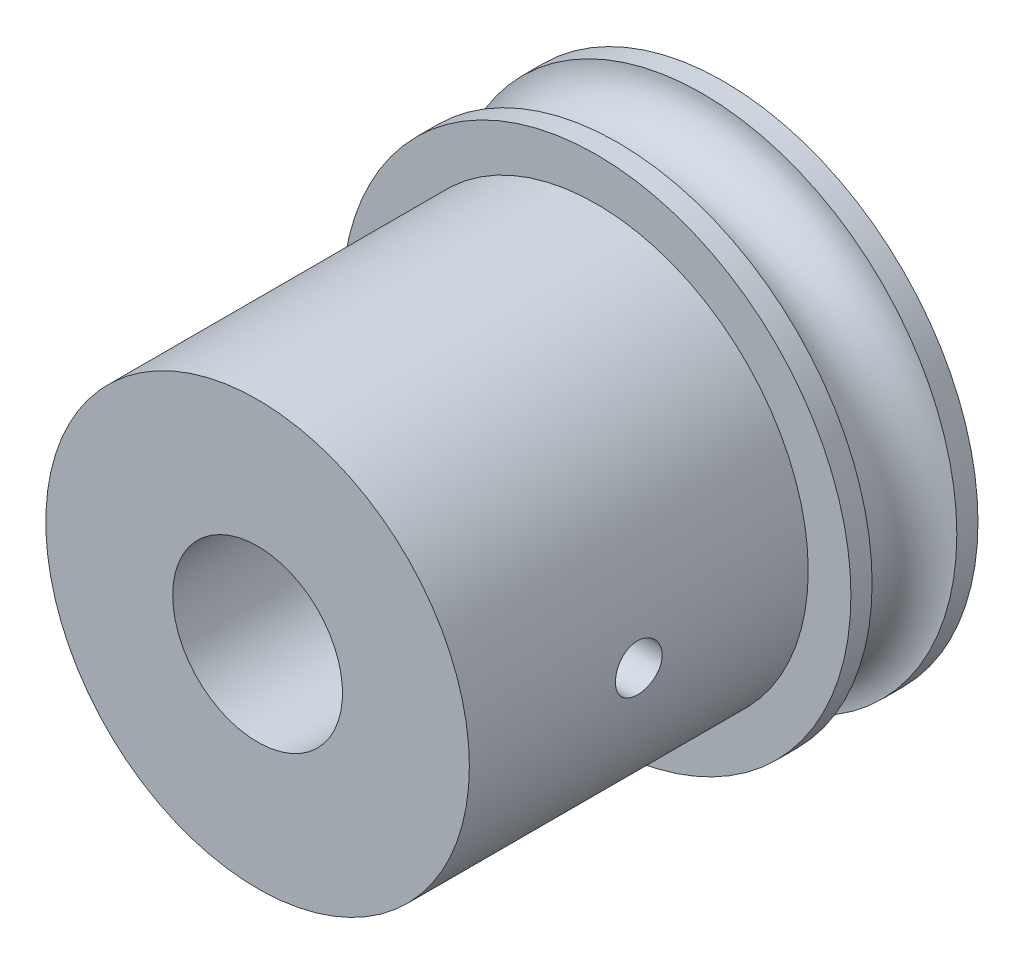
ISO-10303-21;
HEADER;
FILE_DESCRIPTION(('STEP AP214'),'2;1');
FILE_NAME('part.step','',(''),(''),'','','');
FILE_SCHEMA(('AUTOMOTIVE_DESIGN { 1 0 10303 214 1 1 1 1 }'));
ENDSEC;
DATA;
#1=APPLICATION_CONTEXT('core data for automotive mechanical design processes');
#2=APPLICATION_PROTOCOL_DEFINITION('international standard','automotive_design',2000,#1);
#3=PRODUCT_CONTEXT('',#1,'mechanical');
#4=PRODUCT('Part','Part','',(#3));
#5=PRODUCT_RELATED_PRODUCT_CATEGORY('part','',(#4));
#6=PRODUCT_DEFINITION_FORMATION('','',#4);
#7=PRODUCT_DEFINITION_CONTEXT('part definition',#1,'design');
#8=PRODUCT_DEFINITION('design','',#6,#7);
#9=PRODUCT_DEFINITION_SHAPE('','',#8);
#10=(LENGTH_UNIT() NAMED_UNIT(*) SI_UNIT(.MILLI.,.METRE.));
#11=(NAMED_UNIT(*) PLANE_ANGLE_UNIT() SI_UNIT($,.RADIAN.));
#12=(NAMED_UNIT(*) SI_UNIT($,.STERADIAN.) SOLID_ANGLE_UNIT());
#13=UNCERTAINTY_MEASURE_WITH_UNIT(LENGTH_MEASURE(1.E-05),#10,'distance_accuracy_value','');
#14=(GEOMETRIC_REPRESENTATION_CONTEXT(3) GLOBAL_UNCERTAINTY_ASSIGNED_CONTEXT((#13)) GLOBAL_UNIT_ASSIGNED_CONTEXT((#10,
#11,#12)) REPRESENTATION_CONTEXT('',''));
#15=CARTESIAN_POINT('',(0.,0.,0.));
#16=DIRECTION('',(0.,0.,1.));
#17=DIRECTION('',(1.,0.,0.));
#18=AXIS2_PLACEMENT_3D('',#15,#16,#17);
#19=CARTESIAN_POINT('',(0.,0.,2.38125));
#20=DIRECTION('',(0.,0.,1.));
#21=DIRECTION('',(1.,0.,0.));
#22=AXIS2_PLACEMENT_3D('',#19,#20,#21);
#23=PLANE('',#22);
#24=CARTESIAN_POINT('',(0.,0.,2.38125));
#25=DIRECTION('',(0.,0.,1.));
#26=DIRECTION('',(1.,0.,0.));
#27=AXIS2_PLACEMENT_3D('',#24,#25,#26);
#28=CIRCLE('',#27,9.5377);
#29=CARTESIAN_POINT('',(9.5377,0.,2.38125));
#30=VERTEX_POINT('',#29);
#31=EDGE_CURVE('E49',#30,#30,#28,.T.);
#32=ORIENTED_EDGE('',*,*,#31,.T.);
#33=EDGE_LOOP('',(#32));
#34=FACE_BOUND('',#33,.T.);
#35=CARTESIAN_POINT('',(0.,0.,2.38125));
#36=DIRECTION('',(0.,0.,1.));
#37=DIRECTION('',(1.,0.,0.));
#38=AXIS2_PLACEMENT_3D('',#35,#36,#37);
#39=CIRCLE('',#38,7.9375);
#40=CARTESIAN_POINT('',(7.9375,0.,2.38125));
#41=VERTEX_POINT('',#40);
#42=EDGE_CURVE('E58',#41,#41,#39,.T.);
#43=ORIENTED_EDGE('',*,*,#42,.F.);
#44=EDGE_LOOP('',(#43));
#45=FACE_BOUND('',#44,.T.);
#46=ADVANCED_FACE('F30',(#34,#45),#23,.T.);
#47=CARTESIAN_POINT('',(0.,0.,-2.38125));
#48=DIRECTION('',(0.,0.,1.));
#49=DIRECTION('',(1.,0.,0.));
#50=AXIS2_PLACEMENT_3D('',#47,#48,#49);
#51=CYLINDRICAL_SURFACE('',#50,9.5377);
#52=CARTESIAN_POINT('',(0.,0.,-2.38125));
#53=DIRECTION('',(0.,0.,1.));
#54=DIRECTION('',(1.,0.,0.));
#55=AXIS2_PLACEMENT_3D('',#52,#53,#54);
#56=CIRCLE('',#55,9.5377);
#57=CARTESIAN_POINT('',(9.5377,0.,-2.38125));
#58=VERTEX_POINT('',#57);
#59=EDGE_CURVE('E54',#58,#58,#56,.T.);
#60=ORIENTED_EDGE('',*,*,#59,.T.);
#61=EDGE_LOOP('',(#60));
#62=FACE_BOUND('',#61,.T.);
#63=CARTESIAN_POINT('',(0.,0.,-1.5875));
#64=DIRECTION('',(0.,0.,1.));
#65=DIRECTION('',(1.,0.,0.));
#66=AXIS2_PLACEMENT_3D('',#63,#64,#65);
#67=CIRCLE('',#66,9.5377);
#68=CARTESIAN_POINT('',(9.5377,0.,-1.5875));
#69=VERTEX_POINT('',#68);
#70=EDGE_CURVE('E41',#69,#69,#67,.T.);
#71=ORIENTED_EDGE('',*,*,#70,.F.);
#72=EDGE_LOOP('',(#71));
#73=FACE_BOUND('',#72,.T.);
#74=ADVANCED_FACE('F32',(#62,#73),#51,.T.);
#75=CARTESIAN_POINT('',(0.,0.,0.));
#76=DIRECTION('',(0.,0.,1.));
#77=DIRECTION('',(1.,0.,0.));
#78=AXIS2_PLACEMENT_3D('',#75,#76,#77);
#79=TOROIDAL_SURFACE('',#78,9.5377,1.5875);
#80=ORIENTED_EDGE('',*,*,#70,.T.);
#81=EDGE_LOOP('',(#80));
#82=FACE_BOUND('',#81,.T.);
#83=CARTESIAN_POINT('',(0.,0.,1.5875));
#84=DIRECTION('',(0.,0.,1.));
#85=DIRECTION('',(1.,0.,0.));
#86=AXIS2_PLACEMENT_3D('',#83,#84,#85);
#87=CIRCLE('',#86,9.5377);
#88=CARTESIAN_POINT('',(9.5377,0.,1.5875));
#89=VERTEX_POINT('',#88);
#90=EDGE_CURVE('E45',#89,#89,#87,.T.);
#91=ORIENTED_EDGE('',*,*,#90,.F.);
#92=EDGE_LOOP('',(#91));
#93=FACE_BOUND('',#92,.T.);
#94=ADVANCED_FACE('F101',(#82,#93),#79,.F.);
#95=CARTESIAN_POINT('',(0.,0.,-2.38125));
#96=DIRECTION('',(0.,0.,1.));
#97=DIRECTION('',(1.,0.,0.));
#98=AXIS2_PLACEMENT_3D('',#95,#96,#97);
#99=CYLINDRICAL_SURFACE('',#98,9.5377);
#100=ORIENTED_EDGE('',*,*,#90,.T.);
#101=EDGE_LOOP('',(#100));
#102=FACE_BOUND('',#101,.T.);
#103=ORIENTED_EDGE('',*,*,#31,.F.);
#104=EDGE_LOOP('',(#103));
#105=FACE_BOUND('',#104,.T.);
#106=ADVANCED_FACE('F105',(#102,#105),#99,.T.);
#107=CARTESIAN_POINT('',(9.5377,0.,-2.38125));
#108=DIRECTION('',(0.,0.,-1.));
#109=DIRECTION('',(-1.,0.,0.));
#110=AXIS2_PLACEMENT_3D('',#107,#108,#109);
#111=PLANE('',#110);
#112=CARTESIAN_POINT('',(0.,0.,-2.38125));
#113=DIRECTION('',(0.,0.,-1.));
#114=DIRECTION('',(-1.,0.,0.));
#115=AXIS2_PLACEMENT_3D('',#112,#113,#114);
#116=CIRCLE('',#115,3.18135000000001);
#117=CARTESIAN_POINT('',(-3.18135000000001,0.,-2.38125));
#118=VERTEX_POINT('',#117);
#119=EDGE_CURVE('E66',#118,#118,#116,.T.);
#120=ORIENTED_EDGE('',*,*,#119,.F.);
#121=EDGE_LOOP('',(#120));
#122=FACE_BOUND('',#121,.T.);
#123=ORIENTED_EDGE('',*,*,#59,.F.);
#124=EDGE_LOOP('',(#123));
#125=FACE_BOUND('',#124,.T.);
#126=ADVANCED_FACE('F92',(#122,#125),#111,.T.);
#127=CARTESIAN_POINT('',(0.,0.,15.08125));
#128=DIRECTION('',(0.,0.,-1.));
#129=DIRECTION('',(-1.,0.,0.));
#130=AXIS2_PLACEMENT_3D('',#127,#128,#129);
#131=CYLINDRICAL_SURFACE('',#130,7.9375);
#132=CARTESIAN_POINT('',(7.9375,0.,9.60754999999999));
#133=CARTESIAN_POINT('',(7.93749938367328,0.0490619926561557,9.60754789006754));
#134=CARTESIAN_POINT('',(7.93704029679439,0.0981557314585638,9.60341581982299));
#135=CARTESIAN_POINT('',(7.9352530584182,0.194980176169832,9.58699566743772));
#136=CARTESIAN_POINT('',(7.93392396893048,0.242709352848368,9.57469878222351));
#137=CARTESIAN_POINT('',(7.93054663857555,0.335388687165406,9.5423130546089));
#138=CARTESIAN_POINT('',(7.92849885157329,0.380340577668423,9.52222912896907));
#139=CARTESIAN_POINT('',(7.9239126273097,0.466226196562132,9.47484946356595));
#140=CARTESIAN_POINT('',(7.92137428239733,0.507160679058063,9.44755508083792));
#141=CARTESIAN_POINT('',(7.91607859338977,0.584036575778851,9.38640229941923));
#142=CARTESIAN_POINT('',(7.91332044008537,0.619958061777014,9.35251891636632));
#143=CARTESIAN_POINT('',(7.90790262055688,0.685616856842306,9.27920342856394));
#144=CARTESIAN_POINT('',(7.90524295906745,0.715353868929134,9.23977105750278));
#145=CARTESIAN_POINT('',(7.90031513953063,0.767871741122241,9.15635015333023));
#146=CARTESIAN_POINT('',(7.89804801835121,0.790634297024192,9.11235003024389));
#147=CARTESIAN_POINT('',(7.89417230269237,0.828440233249586,9.02112271542428));
#148=CARTESIAN_POINT('',(7.89256368858293,0.84348384367728,8.97389561993566));
#149=CARTESIAN_POINT('',(7.89019463010117,0.865365139004085,8.87775981853793));
#150=CARTESIAN_POINT('',(7.88943074272527,0.872236143184026,8.82885878265999));
#151=CARTESIAN_POINT('',(7.88882701034568,0.8776802212697,8.73059211948118));
#152=CARTESIAN_POINT('',(7.88898713606063,0.876253558123005,8.68122650695194));
#153=CARTESIAN_POINT('',(7.89021018966711,0.865170216830182,8.5836626576071));
#154=CARTESIAN_POINT('',(7.89126911307538,0.855550043216213,8.5354602165567));
#155=CARTESIAN_POINT('',(7.89416419883277,0.828409623439237,8.44135819939732));
#156=CARTESIAN_POINT('',(7.8960003737389,0.810889249643005,8.39545866050666));
#157=CARTESIAN_POINT('',(7.90024765742395,0.768405887487115,8.30715079381195));
#158=CARTESIAN_POINT('',(7.90266000501433,0.743426833087172,8.26475025710463));
#159=CARTESIAN_POINT('',(7.90778681587572,0.68674669681497,8.18472929177894));
#160=CARTESIAN_POINT('',(7.91050128992936,0.655045374994405,8.14710903386714));
#161=CARTESIAN_POINT('',(7.91594433419991,0.585617315030354,8.07750449395868));
#162=CARTESIAN_POINT('',(7.91867290167609,0.547859074237669,8.04555162611191));
#163=CARTESIAN_POINT('',(7.9238229549264,0.467498022838126,7.98843280679829));
#164=CARTESIAN_POINT('',(7.92624444023137,0.424895204830004,7.9632668657003));
#165=CARTESIAN_POINT('',(7.93050854948399,0.336031613054232,7.92043703033331));
#166=CARTESIAN_POINT('',(7.93235103922227,0.28976999429397,7.90277487508486));
#167=CARTESIAN_POINT('',(7.93524825901386,0.194912903139289,7.87547774137834));
#168=CARTESIAN_POINT('',(7.93630301779902,0.146317515936041,7.86584247014458));
#169=CARTESIAN_POINT('',(7.93750222667186,0.0484442126005827,7.85491280257637));
#170=CARTESIAN_POINT('',(7.93765140452745,-0.000828810368093511,7.85357508638203));
#171=CARTESIAN_POINT('',(7.93703535471296,-0.0988972945590938,7.85916451173487));
#172=CARTESIAN_POINT('',(7.93627014215401,-0.147692763659993,7.86609151670003));
#173=CARTESIAN_POINT('',(7.9339142820136,-0.243294896252318,7.88797779269884));
#174=CARTESIAN_POINT('',(7.9323257341104,-0.290106292588913,7.90291663521453));
#175=CARTESIAN_POINT('',(7.92850126571295,-0.380558960934172,7.94038143861139));
#176=CARTESIAN_POINT('',(7.92626532773723,-0.424200147297842,7.96290760437574));
#177=CARTESIAN_POINT('',(7.92138406180562,-0.507268518131818,8.01501402958197));
#178=CARTESIAN_POINT('',(7.91873710729328,-0.546677859333208,8.04462257997838));
#179=CARTESIAN_POINT('',(7.91333564800411,-0.619982876454922,8.11001294402315));
#180=CARTESIAN_POINT('',(7.9105811399252,-0.653878382926115,8.14579494732217));
#181=CARTESIAN_POINT('',(7.90526065431537,-0.715345259314541,8.22270623036552));
#182=CARTESIAN_POINT('',(7.90269556161207,-0.742888085629021,8.26385839187597));
#183=CARTESIAN_POINT('',(7.89805825033102,-0.790671165596937,8.35022968990084));
#184=CARTESIAN_POINT('',(7.89598602375878,-0.810911537701794,8.39544876043201));
#185=CARTESIAN_POINT('',(7.89257481606735,-0.843467983538278,8.48857464464758));
#186=CARTESIAN_POINT('',(7.89123429652011,-0.855800692900926,8.53647558386408));
#187=CARTESIAN_POINT('',(7.88943365987175,-0.872245560755644,8.63368402337945));
#188=CARTESIAN_POINT('',(7.88897351146513,-0.87635801155557,8.68299147360032));
#189=CARTESIAN_POINT('',(7.88898647987898,-0.876241062230753,8.78132948800363));
#190=CARTESIAN_POINT('',(7.88945458039106,-0.87205649963949,8.83036011228769));
#191=CARTESIAN_POINT('',(7.89126057381249,-0.855558684865616,8.92701703885766));
#192=CARTESIAN_POINT('',(7.89259846739277,-0.84324542641272,8.97464334006028));
#193=CARTESIAN_POINT('',(7.89599184722616,-0.810852780449801,9.06713714649803));
#194=CARTESIAN_POINT('',(7.89804718084822,-0.790775044687588,9.11200523614008));
#195=CARTESIAN_POINT('',(7.90264414572172,-0.743427877387268,9.1977421621431));
#196=CARTESIAN_POINT('',(7.9051857777142,-0.716158434890103,9.23861099240969));
#197=CARTESIAN_POINT('',(7.91048543049676,-0.655034196229591,9.31541894010693));
#198=CARTESIAN_POINT('',(7.91324450592204,-0.621145955319981,9.35133137038248));
#199=CARTESIAN_POINT('',(7.91865863916851,-0.547814182211279,9.4169783235801));
#200=CARTESIAN_POINT('',(7.92131367208099,-0.508369329970102,9.44671137434707));
#201=CARTESIAN_POINT('',(7.92622911219221,-0.424911286199697,9.49922857341522));
#202=CARTESIAN_POINT('',(7.92848830901074,-0.380884717145177,9.52199156214115));
#203=CARTESIAN_POINT('',(7.93234480699043,-0.28963589105155,9.55977027053925));
#204=CARTESIAN_POINT('',(7.93394284355681,-0.242417252943789,9.57479460246358));
#205=CARTESIAN_POINT('',(7.93590173942843,-0.162449954751472,9.59298118817769));
#206=CARTESIAN_POINT('',(7.93649824402587,-0.130209963756221,9.59843687905224));
#207=CARTESIAN_POINT('',(7.93729757844696,-0.0653180047921323,9.60572197776084));
#208=CARTESIAN_POINT('',(7.93750041035742,-0.0326660390080473,9.60755140481728));
#209=CARTESIAN_POINT('',(7.9375,0.,9.60754999999999));
#210=B_SPLINE_CURVE_WITH_KNOTS('',3,(#132,#133,#134,#135,#136,#137,#138,#139,#140,#141,#142,
#143,#144,#145,#146,#147,#148,#149,#150,#151,#152,#153,#154,#155,#156,#157,#158,#159,#160,#161,
#162,#163,#164,#165,#166,#167,#168,#169,#170,#171,#172,#173,#174,#175,#176,#177,#178,#179,#180,
#181,#182,#183,#184,#185,#186,#187,#188,#189,#190,#191,#192,#193,#194,#195,#196,#197,#198,#199,
#200,#201,#202,#203,#204,#205,#206,#207,#208,#209),.UNSPECIFIED.,.T.,.F.,(4,2,2,2,2,2,2,2,2,2,2,
2,2,2,2,2,2,2,2,2,2,2,2,2,2,2,2,2,2,2,2,2,2,2,2,2,2,2,4),(0.,0.147066680671155,
0.294292182531944,0.441424876756524,0.588529899755392,0.736203997028413,0.883885184019539,
1.03195069904304,1.18001179992937,1.3274671716124,1.47491787055801,1.62171504864538,
1.76851459842818,1.91563266474095,2.06275598325107,2.21067091541824,2.35858607356431,
2.50653549273198,2.65447951529828,2.80165049735686,2.94881904731526,3.09561411985525,
3.24241315667247,3.38980868141452,3.53720873500597,3.68525871060685,3.83330628461534,
3.98104137486613,4.12877121164523,4.27570488373141,4.42263866915889,4.56954121434168,
4.7164439833827,4.86410920793798,5.01180957154701,5.1599539743687,5.3079331510117,
5.40585235758241,5.50377104509388),.UNSPECIFIED.);
#211=CARTESIAN_POINT('',(7.9375,0.,9.60754999999999));
#212=VERTEX_POINT('',#211);
#213=EDGE_CURVE('E69',#212,#212,#210,.T.);
#214=ORIENTED_EDGE('',*,*,#213,.T.);
#215=EDGE_LOOP('',(#214));
#216=FACE_BOUND('',#215,.T.);
#217=CARTESIAN_POINT('',(0.,0.,15.08125));
#218=DIRECTION('',(0.,0.,1.));
#219=DIRECTION('',(1.,0.,0.));
#220=AXIS2_PLACEMENT_3D('',#217,#218,#219);
#221=CIRCLE('',#220,7.9375);
#222=CARTESIAN_POINT('',(7.9375,0.,15.08125));
#223=VERTEX_POINT('',#222);
#224=EDGE_CURVE('E57',#223,#223,#221,.T.);
#225=ORIENTED_EDGE('',*,*,#224,.F.);
#226=EDGE_LOOP('',(#225));
#227=FACE_BOUND('',#226,.T.);
#228=ORIENTED_EDGE('',*,*,#42,.T.);
#229=EDGE_LOOP('',(#228));
#230=FACE_BOUND('',#229,.T.);
#231=ADVANCED_FACE('F74',(#216,#227,#230),#131,.T.);
#232=CARTESIAN_POINT('',(0.,0.,15.08125));
#233=DIRECTION('',(0.,0.,1.));
#234=DIRECTION('',(1.,0.,0.));
#235=AXIS2_PLACEMENT_3D('',#232,#233,#234);
#236=PLANE('',#235);
#237=CARTESIAN_POINT('',(0.,0.,15.08125));
#238=DIRECTION('',(0.,0.,-1.));
#239=DIRECTION('',(-1.,0.,0.));
#240=AXIS2_PLACEMENT_3D('',#237,#238,#239);
#241=CIRCLE('',#240,3.18135000000001);
#242=CARTESIAN_POINT('',(-3.18135000000001,0.,15.08125));
#243=VERTEX_POINT('',#242);
#244=EDGE_CURVE('E61',#243,#243,#241,.T.);
#245=ORIENTED_EDGE('',*,*,#244,.T.);
#246=EDGE_LOOP('',(#245));
#247=FACE_BOUND('',#246,.T.);
#248=ORIENTED_EDGE('',*,*,#224,.T.);
#249=EDGE_LOOP('',(#248));
#250=FACE_BOUND('',#249,.T.);
#251=ADVANCED_FACE('F86',(#247,#250),#236,.T.);
#252=CARTESIAN_POINT('',(0.,0.,-2.38125));
#253=DIRECTION('',(0.,0.,-1.));
#254=DIRECTION('',(-1.,0.,0.));
#255=AXIS2_PLACEMENT_3D('',#252,#253,#254);
#256=CYLINDRICAL_SURFACE('',#255,3.18135000000001);
#257=CARTESIAN_POINT('',(3.18135000000001,0.,9.60754999999999));
#258=CARTESIAN_POINT('',(3.18134933604573,-0.0482485030724985,9.60754898243559));
#259=CARTESIAN_POINT('',(3.18024166604385,-0.0965076916258606,9.60355187617002));
#260=CARTESIAN_POINT('',(3.17593067411273,-0.191631988979954,9.58769977924431));
#261=CARTESIAN_POINT('',(3.17272644171537,-0.238496482862316,9.57584137465126));
#262=CARTESIAN_POINT('',(3.16457534411051,-0.329444856675354,9.54468437859155));
#263=CARTESIAN_POINT('',(3.15963080991353,-0.373532363511861,9.52539573615151));
#264=CARTESIAN_POINT('',(3.14851945276881,-0.45784694461303,9.47996368913408));
#265=CARTESIAN_POINT('',(3.14235252699227,-0.498073693684029,9.45381970781887));
#266=CARTESIAN_POINT('',(3.12929054827666,-0.574514402250675,9.39474040982789));
#267=CARTESIAN_POINT('',(3.12238240358325,-0.610619877643999,9.36166762349404));
#268=CARTESIAN_POINT('',(3.10869908806593,-0.676848465830282,9.28996316186003));
#269=CARTESIAN_POINT('',(3.10192393571902,-0.706970752589245,9.25133072026643));
#270=CARTESIAN_POINT('',(3.0891386738576,-0.760917323555329,9.16872457504654));
#271=CARTESIAN_POINT('',(3.08314502175826,-0.784614892447825,9.12466533654994));
#272=CARTESIAN_POINT('',(3.07279469135991,-0.824222433492153,9.03299595348661));
#273=CARTESIAN_POINT('',(3.06843768865861,-0.840133949116554,8.98538651485397));
#274=CARTESIAN_POINT('',(3.06198946162098,-0.863337289485435,8.88917409717608));
#275=CARTESIAN_POINT('',(3.05984640830504,-0.870826668728521,8.84062232228048));
#276=CARTESIAN_POINT('',(3.0579140344396,-0.877589320149604,8.74290779892188));
#277=CARTESIAN_POINT('',(3.05812424198531,-0.876864239591614,8.69374517492896));
#278=CARTESIAN_POINT('',(3.06082836588407,-0.86737496613689,8.59776232206896));
#279=CARTESIAN_POINT('',(3.06325378217703,-0.858851893844449,8.55091601508154));
#280=CARTESIAN_POINT('',(3.07000507150618,-0.834395615653295,8.45934551720747));
#281=CARTESIAN_POINT('',(3.07433110546762,-0.818461782278878,8.41462150637096));
#282=CARTESIAN_POINT('',(3.08445499805081,-0.779444668555224,8.32794650941261));
#283=CARTESIAN_POINT('',(3.09026977667304,-0.756278477661565,8.28603490583309));
#284=CARTESIAN_POINT('',(3.10270713042689,-0.703512027140254,8.2066102377564));
#285=CARTESIAN_POINT('',(3.10932987397109,-0.673910425103654,8.16909809349139));
#286=CARTESIAN_POINT('',(3.12292023781329,-0.607889480687763,8.09816197711828));
#287=CARTESIAN_POINT('',(3.12989182727838,-0.571268235451542,8.06492639887398));
#288=CARTESIAN_POINT('',(3.14318769746419,-0.492886154822925,8.00502837971949));
#289=CARTESIAN_POINT('',(3.14951194917032,-0.451125089241097,7.97836623336447));
#290=CARTESIAN_POINT('',(3.16084389440224,-0.363344332238074,7.93228120521025));
#291=CARTESIAN_POINT('',(3.16584500027952,-0.317304819052815,7.91289435254468));
#292=CARTESIAN_POINT('',(3.17391963481336,-0.222450369641219,7.88219115281968));
#293=CARTESIAN_POINT('',(3.17699361384228,-0.173636084793699,7.87087292002721));
#294=CARTESIAN_POINT('',(3.18079873377738,-0.076223947240032,7.85692853247731));
#295=CARTESIAN_POINT('',(3.1815988329616,-0.0276653671749669,7.85404645685195));
#296=CARTESIAN_POINT('',(3.18096532577904,0.0692419960400768,7.85634677013191));
#297=CARTESIAN_POINT('',(3.17953196699299,0.117590801847971,7.86152826518339));
#298=CARTESIAN_POINT('',(3.1746373101869,0.211779472846797,7.87959938918361));
#299=CARTESIAN_POINT('',(3.17121404350483,0.257649214321831,7.89234455357729));
#300=CARTESIAN_POINT('',(3.16272956773496,0.346593800008106,7.92501194514455));
#301=CARTESIAN_POINT('',(3.15766817539291,0.389668330876518,7.94493497532163));
#302=CARTESIAN_POINT('',(3.14630940676444,0.472780931930691,7.99185568827568));
#303=CARTESIAN_POINT('',(3.13998877173549,0.512738427745742,8.01899032160324));
#304=CARTESIAN_POINT('',(3.12684120240803,0.587622134298184,8.07939333662314));
#305=CARTESIAN_POINT('',(3.1200141613764,0.622547279797395,8.11266301358177));
#306=CARTESIAN_POINT('',(3.1063666226986,0.687465971255997,8.18558867935755));
#307=CARTESIAN_POINT('',(3.09955256416805,0.717278478241418,8.22540734780583));
#308=CARTESIAN_POINT('',(3.08692748211493,0.769804548258407,8.3096279184525));
#309=CARTESIAN_POINT('',(3.08111641937793,0.792518388856777,8.35402964135736));
#310=CARTESIAN_POINT('',(3.07122288187569,0.830032810982777,8.4459490743997));
#311=CARTESIAN_POINT('',(3.06713073706788,0.844877787246941,8.49344756795768));
#312=CARTESIAN_POINT('',(3.0611416408222,0.866329086144377,8.59039982437103));
#313=CARTESIAN_POINT('',(3.05924408199995,0.872937688356208,8.63985304230682));
#314=CARTESIAN_POINT('',(3.05791211725679,0.877591196960503,8.73745090242579));
#315=CARTESIAN_POINT('',(3.05839373336087,0.875928057458353,8.78558067936015));
#316=CARTESIAN_POINT('',(3.06156788888977,0.86476750526962,8.8808450863277));
#317=CARTESIAN_POINT('',(3.06426036400865,0.855270320447147,8.92797974526438));
#318=CARTESIAN_POINT('',(3.07150120187039,0.828885655502423,9.01952084325305));
#319=CARTESIAN_POINT('',(3.07603302434469,0.812063945250954,9.06394764048434));
#320=CARTESIAN_POINT('',(3.08644138367859,0.771558630286205,9.14938276550289));
#321=CARTESIAN_POINT('',(3.09231814405564,0.747873884819498,9.19039052352716));
#322=CARTESIAN_POINT('',(3.10498346830386,0.693446557832943,9.26920741895729));
#323=CARTESIAN_POINT('',(3.11179477923116,0.662506628248596,9.30687663512415));
#324=CARTESIAN_POINT('',(3.12543918669582,0.594817412425563,9.37658324014455));
#325=CARTESIAN_POINT('',(3.13227228819567,0.558066694108766,9.4086192365605));
#326=CARTESIAN_POINT('',(3.14538080464101,0.478766797797373,9.46688619027719));
#327=CARTESIAN_POINT('',(3.15163952717503,0.436102520036484,9.49296459234084));
#328=CARTESIAN_POINT('',(3.16270746644613,0.346823621287088,9.53753841165114));
#329=CARTESIAN_POINT('',(3.16751755105796,0.30021138704136,9.556038371523));
#330=CARTESIAN_POINT('',(3.17457437535954,0.211522376429729,9.58270451611983));
#331=CARTESIAN_POINT('',(3.17709611146821,0.169803387556733,9.5919990617886));
#332=CARTESIAN_POINT('',(3.18048412347212,0.0853923147510167,9.60442190343085));
#333=CARTESIAN_POINT('',(3.18135058760529,0.042700342025077,9.60755090055327));
#334=CARTESIAN_POINT('',(3.18135000000001,0.,9.60754999999999));
#335=B_SPLINE_CURVE_WITH_KNOTS('',3,(#257,#258,#259,#260,#261,#262,#263,#264,#265,#266,#267,
#268,#269,#270,#271,#272,#273,#274,#275,#276,#277,#278,#279,#280,#281,#282,#283,#284,#285,#286,
#287,#288,#289,#290,#291,#292,#293,#294,#295,#296,#297,#298,#299,#300,#301,#302,#303,#304,#305,
#306,#307,#308,#309,#310,#311,#312,#313,#314,#315,#316,#317,#318,#319,#320,#321,#322,#323,#324,
#325,#326,#327,#328,#329,#330,#331,#332,#333,#334),.UNSPECIFIED.,.T.,.F.,(4,2,2,2,2,2,2,2,2,2,2,
2,2,2,2,2,2,2,2,2,2,2,2,2,2,2,2,2,2,2,2,2,2,2,2,2,2,2,4),(0.,0.144588852617819,
0.289240537132239,0.433699203745185,0.578170027528559,0.725837505480058,0.873525356131099,
1.02394329831835,1.17433141022988,1.32111313720355,1.46786543022999,1.61022796106423,
1.75260254805509,1.89667325412922,2.04077404183897,2.18990451618064,2.33904167183734,
2.48890794079391,2.6387391727165,2.78397543074723,2.92919559035869,3.07172750951636,
3.21427537898464,3.3597521511064,3.50525967237281,3.65516671802683,3.80506790139288,
3.95411411664879,4.10311907126498,4.2469029611355,4.39068266899895,4.53319711904507,
4.67573527102338,4.82272570414634,4.9697524199232,5.12020296035254,5.27056318617832,
5.39854012424452,5.52650250787572),.UNSPECIFIED.);
#336=CARTESIAN_POINT('',(3.18135000000001,0.,9.60754999999999));
#337=VERTEX_POINT('',#336);
#338=EDGE_CURVE('E10',#337,#337,#335,.T.);
#339=ORIENTED_EDGE('',*,*,#338,.T.);
#340=EDGE_LOOP('',(#339));
#341=FACE_BOUND('',#340,.T.);
#342=ORIENTED_EDGE('',*,*,#244,.F.);
#343=EDGE_LOOP('',(#342));
#344=FACE_BOUND('',#343,.T.);
#345=ORIENTED_EDGE('',*,*,#119,.T.);
#346=EDGE_LOOP('',(#345));
#347=FACE_BOUND('',#346,.T.);
#348=ADVANCED_FACE('F81',(#341,#344,#347),#256,.F.);
#349=CARTESIAN_POINT('',(3.05828156527485,0.,8.73125));
#350=DIRECTION('',(-1.,0.,0.));
#351=DIRECTION('',(0.,0.,1.));
#352=AXIS2_PLACEMENT_3D('',#349,#350,#351);
#353=CYLINDRICAL_SURFACE('',#352,0.876299999999987);
#354=ORIENTED_EDGE('',*,*,#338,.F.);
#355=EDGE_LOOP('',(#354));
#356=FACE_BOUND('',#355,.T.);
#357=ORIENTED_EDGE('',*,*,#213,.F.);
#358=EDGE_LOOP('',(#357));
#359=FACE_BOUND('',#358,.T.);
#360=ADVANCED_FACE('F78',(#356,#359),#353,.F.);
#361=CLOSED_SHELL('',(#46,#74,#94,#106,#126,#231,#251,#348,#360));
#362=MANIFOLD_SOLID_BREP('B2',#361);
#363=ADVANCED_BREP_SHAPE_REPRESENTATION('',(#18,#362),#14);
#364=SHAPE_DEFINITION_REPRESENTATION(#9,#363);
ENDSEC;
END-ISO-10303-21;
